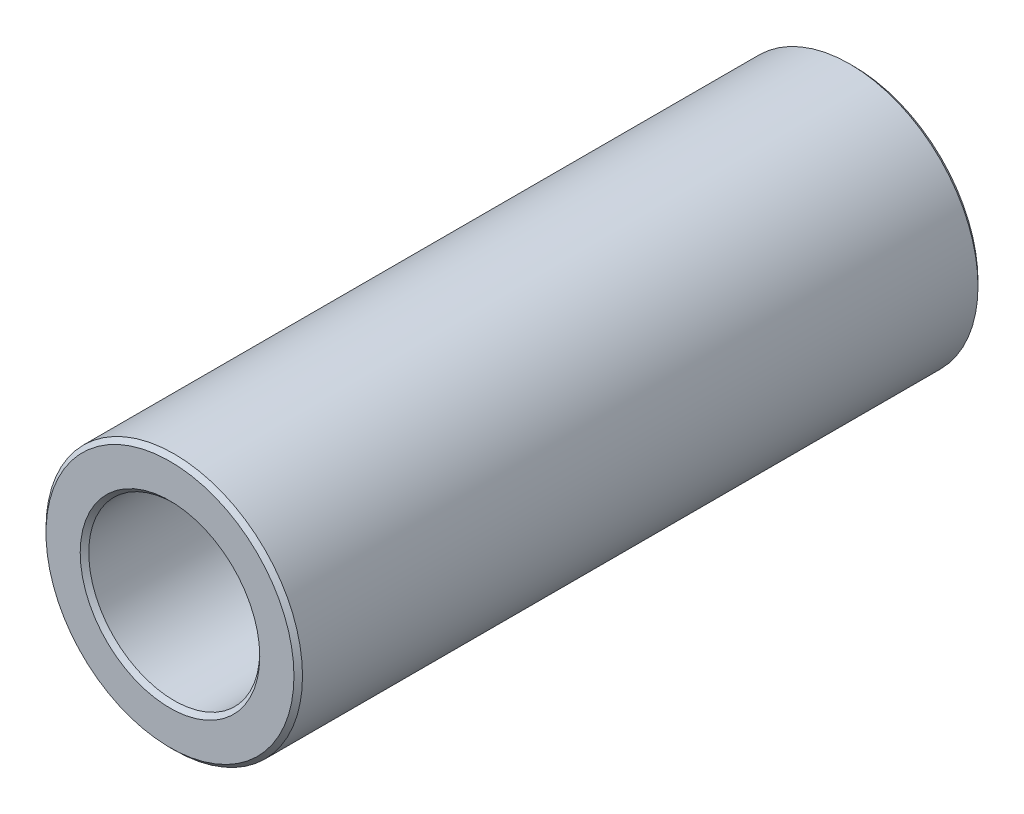
ISO-10303-21;
HEADER;
FILE_DESCRIPTION(('STEP AP214'),'2;1');
FILE_NAME('part.step','',(''),(''),'','','');
FILE_SCHEMA(('AUTOMOTIVE_DESIGN { 1 0 10303 214 1 1 1 1 }'));
ENDSEC;
DATA;
#1=APPLICATION_CONTEXT('core data for automotive mechanical design processes');
#2=APPLICATION_PROTOCOL_DEFINITION('international standard','automotive_design',2000,#1);
#3=PRODUCT_CONTEXT('',#1,'mechanical');
#4=PRODUCT('Part','Part','',(#3));
#5=PRODUCT_RELATED_PRODUCT_CATEGORY('part','',(#4));
#6=PRODUCT_DEFINITION_FORMATION('','',#4);
#7=PRODUCT_DEFINITION_CONTEXT('part definition',#1,'design');
#8=PRODUCT_DEFINITION('design','',#6,#7);
#9=PRODUCT_DEFINITION_SHAPE('','',#8);
#10=(LENGTH_UNIT() NAMED_UNIT(*) SI_UNIT(.MILLI.,.METRE.));
#11=(NAMED_UNIT(*) PLANE_ANGLE_UNIT() SI_UNIT($,.RADIAN.));
#12=(NAMED_UNIT(*) SI_UNIT($,.STERADIAN.) SOLID_ANGLE_UNIT());
#13=UNCERTAINTY_MEASURE_WITH_UNIT(LENGTH_MEASURE(1.E-05),#10,'distance_accuracy_value','');
#14=(GEOMETRIC_REPRESENTATION_CONTEXT(3) GLOBAL_UNCERTAINTY_ASSIGNED_CONTEXT((#13)) GLOBAL_UNIT_ASSIGNED_CONTEXT((#10,
#11,#12)) REPRESENTATION_CONTEXT('',''));
#15=CARTESIAN_POINT('',(0.,0.,0.));
#16=DIRECTION('',(0.,0.,1.));
#17=DIRECTION('',(1.,0.,0.));
#18=AXIS2_PLACEMENT_3D('',#15,#16,#17);
#19=CARTESIAN_POINT('',(0.,0.,-12.7));
#20=DIRECTION('',(0.,0.,1.));
#21=DIRECTION('',(1.,0.,0.));
#22=AXIS2_PLACEMENT_3D('',#19,#20,#21);
#23=CYLINDRICAL_SURFACE('',#22,4.7625);
#24=CARTESIAN_POINT('',(0.,0.,12.54125));
#25=DIRECTION('',(0.,0.,1.));
#26=DIRECTION('',(1.,0.,0.));
#27=AXIS2_PLACEMENT_3D('',#24,#25,#26);
#28=CIRCLE('',#27,4.7625);
#29=CARTESIAN_POINT('',(4.7625,0.,12.54125));
#30=VERTEX_POINT('',#29);
#31=EDGE_CURVE('E61',#30,#30,#28,.F.);
#32=ORIENTED_EDGE('',*,*,#31,.T.);
#33=EDGE_LOOP('',(#32));
#34=FACE_BOUND('',#33,.T.);
#35=CARTESIAN_POINT('',(0.,0.,-12.54125));
#36=DIRECTION('',(0.,0.,1.));
#37=DIRECTION('',(1.,0.,0.));
#38=AXIS2_PLACEMENT_3D('',#35,#36,#37);
#39=CIRCLE('',#38,4.7625);
#40=CARTESIAN_POINT('',(4.7625,0.,-12.54125));
#41=VERTEX_POINT('',#40);
#42=EDGE_CURVE('E64',#41,#41,#39,.T.);
#43=ORIENTED_EDGE('',*,*,#42,.T.);
#44=EDGE_LOOP('',(#43));
#45=FACE_BOUND('',#44,.T.);
#46=ADVANCED_FACE('F41',(#34,#45),#23,.T.);
#47=CARTESIAN_POINT('',(0.,0.,-12.7));
#48=DIRECTION('',(0.,0.,1.));
#49=DIRECTION('',(1.,0.,0.));
#50=AXIS2_PLACEMENT_3D('',#47,#48,#49);
#51=PLANE('',#50);
#52=CARTESIAN_POINT('',(0.,0.,-12.7));
#53=DIRECTION('',(0.,0.,1.));
#54=DIRECTION('',(1.,0.,0.));
#55=AXIS2_PLACEMENT_3D('',#52,#53,#54);
#56=CIRCLE('',#55,4.60374999999999);
#57=CARTESIAN_POINT('',(4.60374999999999,0.,-12.7));
#58=VERTEX_POINT('',#57);
#59=EDGE_CURVE('E52',#58,#58,#56,.F.);
#60=ORIENTED_EDGE('',*,*,#59,.T.);
#61=EDGE_LOOP('',(#60));
#62=FACE_BOUND('',#61,.T.);
#63=CARTESIAN_POINT('',(0.,0.,-12.7));
#64=DIRECTION('',(0.,0.,1.));
#65=DIRECTION('',(1.,0.,0.));
#66=AXIS2_PLACEMENT_3D('',#63,#64,#65);
#67=CIRCLE('',#66,3.33375);
#68=CARTESIAN_POINT('',(3.33375,0.,-12.7));
#69=VERTEX_POINT('',#68);
#70=EDGE_CURVE('E56',#69,#69,#67,.T.);
#71=ORIENTED_EDGE('',*,*,#70,.T.);
#72=EDGE_LOOP('',(#71));
#73=FACE_BOUND('',#72,.T.);
#74=ADVANCED_FACE('F89',(#62,#73),#51,.F.);
#75=CARTESIAN_POINT('',(0.,0.,-12.7));
#76=DIRECTION('',(0.,0.,1.));
#77=DIRECTION('',(1.,0.,0.));
#78=AXIS2_PLACEMENT_3D('',#75,#76,#77);
#79=CYLINDRICAL_SURFACE('',#78,3.175);
#80=CARTESIAN_POINT('',(0.,0.,12.54125));
#81=DIRECTION('',(0.,0.,1.));
#82=DIRECTION('',(1.,0.,0.));
#83=AXIS2_PLACEMENT_3D('',#80,#81,#82);
#84=CIRCLE('',#83,3.175);
#85=CARTESIAN_POINT('',(3.175,0.,12.54125));
#86=VERTEX_POINT('',#85);
#87=EDGE_CURVE('E10',#86,#86,#84,.T.);
#88=ORIENTED_EDGE('',*,*,#87,.T.);
#89=EDGE_LOOP('',(#88));
#90=FACE_BOUND('',#89,.T.);
#91=CARTESIAN_POINT('',(0.,0.,-12.54125));
#92=DIRECTION('',(0.,0.,1.));
#93=DIRECTION('',(1.,0.,0.));
#94=AXIS2_PLACEMENT_3D('',#91,#92,#93);
#95=CIRCLE('',#94,3.175);
#96=CARTESIAN_POINT('',(3.175,0.,-12.54125));
#97=VERTEX_POINT('',#96);
#98=EDGE_CURVE('E48',#97,#97,#95,.F.);
#99=ORIENTED_EDGE('',*,*,#98,.T.);
#100=EDGE_LOOP('',(#99));
#101=FACE_BOUND('',#100,.T.);
#102=ADVANCED_FACE('F95',(#90,#101),#79,.F.);
#103=CARTESIAN_POINT('',(0.,0.,12.7));
#104=DIRECTION('',(0.,0.,1.));
#105=DIRECTION('',(1.,0.,0.));
#106=AXIS2_PLACEMENT_3D('',#103,#104,#105);
#107=PLANE('',#106);
#108=CARTESIAN_POINT('',(0.,0.,12.7));
#109=DIRECTION('',(0.,0.,1.));
#110=DIRECTION('',(1.,0.,0.));
#111=AXIS2_PLACEMENT_3D('',#108,#109,#110);
#112=CIRCLE('',#111,4.60375);
#113=CARTESIAN_POINT('',(4.60375,0.,12.7));
#114=VERTEX_POINT('',#113);
#115=EDGE_CURVE('E67',#114,#114,#112,.T.);
#116=ORIENTED_EDGE('',*,*,#115,.T.);
#117=EDGE_LOOP('',(#116));
#118=FACE_BOUND('',#117,.T.);
#119=CARTESIAN_POINT('',(0.,0.,12.7));
#120=DIRECTION('',(0.,0.,1.));
#121=DIRECTION('',(1.,0.,0.));
#122=AXIS2_PLACEMENT_3D('',#119,#120,#121);
#123=CIRCLE('',#122,3.33375);
#124=CARTESIAN_POINT('',(3.33375,0.,12.7));
#125=VERTEX_POINT('',#124);
#126=EDGE_CURVE('E70',#125,#125,#123,.F.);
#127=ORIENTED_EDGE('',*,*,#126,.T.);
#128=EDGE_LOOP('',(#127));
#129=FACE_BOUND('',#128,.T.);
#130=ADVANCED_FACE('F74',(#118,#129),#107,.T.);
#131=CARTESIAN_POINT('',(0.,0.,12.7));
#132=DIRECTION('',(0.,0.,-1.));
#133=DIRECTION('',(-1.,0.,0.));
#134=AXIS2_PLACEMENT_3D('',#131,#132,#133);
#135=CONICAL_SURFACE('',#134,4.60375,0.78539816339744);
#136=ORIENTED_EDGE('',*,*,#31,.F.);
#137=EDGE_LOOP('',(#136));
#138=FACE_BOUND('',#137,.T.);
#139=ORIENTED_EDGE('',*,*,#115,.F.);
#140=EDGE_LOOP('',(#139));
#141=FACE_BOUND('',#140,.T.);
#142=ADVANCED_FACE('F85',(#138,#141),#135,.T.);
#143=CARTESIAN_POINT('',(0.,0.,-12.54125));
#144=DIRECTION('',(0.,0.,1.));
#145=DIRECTION('',(1.,0.,0.));
#146=AXIS2_PLACEMENT_3D('',#143,#144,#145);
#147=CONICAL_SURFACE('',#146,4.7625,0.785398163397451);
#148=ORIENTED_EDGE('',*,*,#59,.F.);
#149=EDGE_LOOP('',(#148));
#150=FACE_BOUND('',#149,.T.);
#151=ORIENTED_EDGE('',*,*,#42,.F.);
#152=EDGE_LOOP('',(#151));
#153=FACE_BOUND('',#152,.T.);
#154=ADVANCED_FACE('F79',(#150,#153),#147,.T.);
#155=CARTESIAN_POINT('',(0.,0.,12.54125));
#156=DIRECTION('',(0.,0.,1.));
#157=DIRECTION('',(1.,0.,0.));
#158=AXIS2_PLACEMENT_3D('',#155,#156,#157);
#159=CONICAL_SURFACE('',#158,3.175,0.78539816339744);
#160=ORIENTED_EDGE('',*,*,#126,.F.);
#161=EDGE_LOOP('',(#160));
#162=FACE_BOUND('',#161,.T.);
#163=ORIENTED_EDGE('',*,*,#87,.F.);
#164=EDGE_LOOP('',(#163));
#165=FACE_BOUND('',#164,.T.);
#166=ADVANCED_FACE('F76',(#162,#165),#159,.F.);
#167=CARTESIAN_POINT('',(0.,0.,-12.7));
#168=DIRECTION('',(0.,0.,-1.));
#169=DIRECTION('',(-1.,0.,0.));
#170=AXIS2_PLACEMENT_3D('',#167,#168,#169);
#171=CONICAL_SURFACE('',#170,3.33375,0.785398163397446);
#172=ORIENTED_EDGE('',*,*,#98,.F.);
#173=EDGE_LOOP('',(#172));
#174=FACE_BOUND('',#173,.T.);
#175=ORIENTED_EDGE('',*,*,#70,.F.);
#176=EDGE_LOOP('',(#175));
#177=FACE_BOUND('',#176,.T.);
#178=ADVANCED_FACE('F43',(#174,#177),#171,.F.);
#179=CLOSED_SHELL('',(#46,#74,#102,#130,#142,#154,#166,#178));
#180=MANIFOLD_SOLID_BREP('B2',#179);
#181=ADVANCED_BREP_SHAPE_REPRESENTATION('',(#18,#180),#14);
#182=SHAPE_DEFINITION_REPRESENTATION(#9,#181);
ENDSEC;
END-ISO-10303-21;
